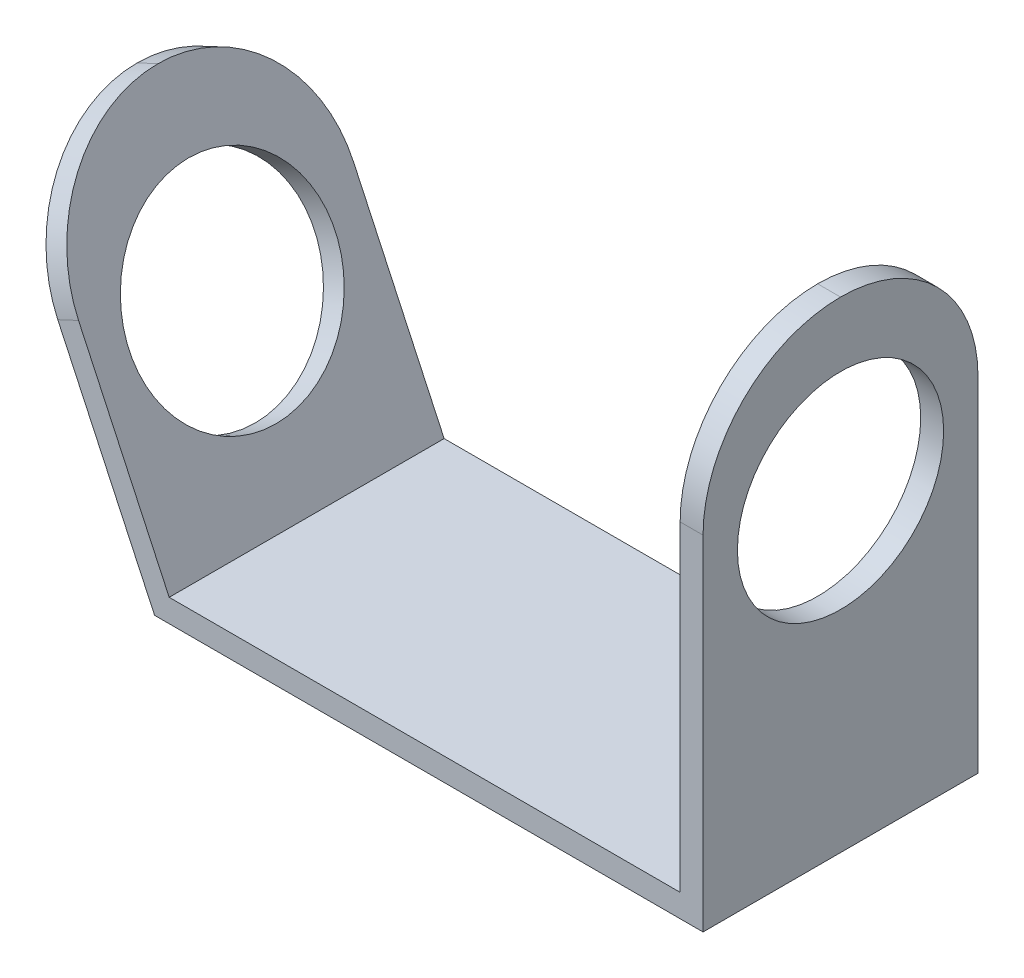
ISO-10303-21;
HEADER;
FILE_DESCRIPTION(('STEP AP214'),'2;1');
FILE_NAME('part.step','',(''),(''),'','','');
FILE_SCHEMA(('AUTOMOTIVE_DESIGN { 1 0 10303 214 1 1 1 1 }'));
ENDSEC;
DATA;
#1=APPLICATION_CONTEXT('core data for automotive mechanical design processes');
#2=APPLICATION_PROTOCOL_DEFINITION('international standard','automotive_design',2000,#1);
#3=PRODUCT_CONTEXT('',#1,'mechanical');
#4=PRODUCT('Part','Part','',(#3));
#5=PRODUCT_RELATED_PRODUCT_CATEGORY('part','',(#4));
#6=PRODUCT_DEFINITION_FORMATION('','',#4);
#7=PRODUCT_DEFINITION_CONTEXT('part definition',#1,'design');
#8=PRODUCT_DEFINITION('design','',#6,#7);
#9=PRODUCT_DEFINITION_SHAPE('','',#8);
#10=(LENGTH_UNIT() NAMED_UNIT(*) SI_UNIT(.MILLI.,.METRE.));
#11=(NAMED_UNIT(*) PLANE_ANGLE_UNIT() SI_UNIT($,.RADIAN.));
#12=(NAMED_UNIT(*) SI_UNIT($,.STERADIAN.) SOLID_ANGLE_UNIT());
#13=UNCERTAINTY_MEASURE_WITH_UNIT(LENGTH_MEASURE(1.E-05),#10,'distance_accuracy_value','');
#14=(GEOMETRIC_REPRESENTATION_CONTEXT(3) GLOBAL_UNCERTAINTY_ASSIGNED_CONTEXT((#13)) GLOBAL_UNIT_ASSIGNED_CONTEXT((#10,
#11,#12)) REPRESENTATION_CONTEXT('',''));
#15=CARTESIAN_POINT('',(0.,0.,0.));
#16=DIRECTION('',(0.,0.,1.));
#17=DIRECTION('',(1.,0.,0.));
#18=AXIS2_PLACEMENT_3D('',#15,#16,#17);
#19=CARTESIAN_POINT('',(-233.,10.,-10.));
#20=DIRECTION('',(0.906307787036651,0.422618261740697,0.));
#21=DIRECTION('',(-0.422618261740697,0.906307787036651,0.));
#22=AXIS2_PLACEMENT_3D('',#19,#20,#21);
#23=PLANE('',#22);
#24=CARTESIAN_POINT('',(-265.46327330811,79.6177142716355,50.));
#25=DIRECTION('',(0.906307787036651,0.422618261740697,0.));
#26=DIRECTION('',(-0.422618261740697,0.906307787036651,0.));
#27=AXIS2_PLACEMENT_3D('',#24,#25,#26);
#28=CIRCLE('',#27,45.);
#29=CARTESIAN_POINT('',(-284.481095086441,120.401564688285,50.));
#30=VERTEX_POINT('',#29);
#31=EDGE_CURVE('E173',#30,#30,#28,.T.);
#32=ORIENTED_EDGE('',*,*,#31,.F.);
#33=EDGE_LOOP('',(#32));
#34=FACE_BOUND('',#33,.T.);
#35=DIRECTION('',(-0.422618261740697,0.906307787036651,0.));
#36=VECTOR('',#35,1.);
#37=CARTESIAN_POINT('',(-233.,10.,-10.));
#38=LINE('',#37,#36);
#39=CARTESIAN_POINT('',(-233.,10.,-10.));
#40=VERTEX_POINT('',#39);
#41=CARTESIAN_POINT('',(-272.569450911778,94.8569613210721,-10.));
#42=VERTEX_POINT('',#41);
#43=EDGE_CURVE('E134',#40,#42,#38,.T.);
#44=ORIENTED_EDGE('',*,*,#43,.T.);
#45=CARTESIAN_POINT('',(-272.569450911778,94.8569613210721,50.));
#46=DIRECTION('',(0.906307787036651,0.422618261740697,0.));
#47=DIRECTION('',(-0.422618261740697,0.906307787036651,0.));
#48=AXIS2_PLACEMENT_3D('',#45,#46,#47);
#49=CIRCLE('',#48,60.);
#50=CARTESIAN_POINT('',(-297.92654661622,149.235428543271,50.));
#51=VERTEX_POINT('',#50);
#52=EDGE_CURVE('E11',#42,#51,#49,.T.);
#53=ORIENTED_EDGE('',*,*,#52,.T.);
#54=CARTESIAN_POINT('',(-272.569450911778,94.8569613210721,50.));
#55=DIRECTION('',(0.906307787036651,0.422618261740697,0.));
#56=DIRECTION('',(-0.422618261740697,0.906307787036651,0.));
#57=AXIS2_PLACEMENT_3D('',#54,#55,#56);
#58=CIRCLE('',#57,60.);
#59=CARTESIAN_POINT('',(-272.569450911778,94.8569613210721,110.));
#60=VERTEX_POINT('',#59);
#61=EDGE_CURVE('E45',#51,#60,#58,.T.);
#62=ORIENTED_EDGE('',*,*,#61,.T.);
#63=DIRECTION('',(-0.422618261740697,0.906307787036651,0.));
#64=VECTOR('',#63,1.);
#65=CARTESIAN_POINT('',(-233.,10.,110.));
#66=LINE('',#65,#64);
#67=CARTESIAN_POINT('',(-233.,10.,110.));
#68=VERTEX_POINT('',#67);
#69=EDGE_CURVE('E147',#68,#60,#66,.T.);
#70=ORIENTED_EDGE('',*,*,#69,.F.);
#71=DIRECTION('',(0.,0.,1.));
#72=VECTOR('',#71,1.);
#73=CARTESIAN_POINT('',(-233.,10.,-10.));
#74=LINE('',#73,#72);
#75=EDGE_CURVE('E161',#40,#68,#74,.T.);
#76=ORIENTED_EDGE('',*,*,#75,.F.);
#77=EDGE_LOOP('',(#44,#53,#62,#70,#76));
#78=FACE_BOUND('',#77,.T.);
#79=ADVANCED_FACE('F36',(#34,#78),#23,.T.);
#80=CARTESIAN_POINT('',(-10.,10.,-10.));
#81=DIRECTION('',(0.,1.,0.));
#82=DIRECTION('',(-1.,0.,0.));
#83=AXIS2_PLACEMENT_3D('',#80,#81,#82);
#84=PLANE('',#83);
#85=ORIENTED_EDGE('',*,*,#75,.T.);
#86=DIRECTION('',(-1.,0.,0.));
#87=VECTOR('',#86,1.);
#88=CARTESIAN_POINT('',(-10.,10.,110.));
#89=LINE('',#88,#87);
#90=CARTESIAN_POINT('',(-10.,10.,110.));
#91=VERTEX_POINT('',#90);
#92=EDGE_CURVE('E144',#91,#68,#89,.T.);
#93=ORIENTED_EDGE('',*,*,#92,.F.);
#94=DIRECTION('',(0.,0.,1.));
#95=VECTOR('',#94,1.);
#96=CARTESIAN_POINT('',(-10.,10.,-10.));
#97=LINE('',#96,#95);
#98=CARTESIAN_POINT('',(-10.,10.,-10.));
#99=VERTEX_POINT('',#98);
#100=EDGE_CURVE('E163',#99,#91,#97,.T.);
#101=ORIENTED_EDGE('',*,*,#100,.F.);
#102=DIRECTION('',(-1.,0.,0.));
#103=VECTOR('',#102,1.);
#104=CARTESIAN_POINT('',(-10.,10.,-10.));
#105=LINE('',#104,#103);
#106=EDGE_CURVE('E157',#99,#40,#105,.T.);
#107=ORIENTED_EDGE('',*,*,#106,.T.);
#108=EDGE_LOOP('',(#85,#93,#101,#107));
#109=FACE_BOUND('',#108,.T.);
#110=ADVANCED_FACE('F212',(#109),#84,.T.);
#111=CARTESIAN_POINT('',(-10.,210.,-10.));
#112=DIRECTION('',(-1.,0.,0.));
#113=DIRECTION('',(0.,0.,1.));
#114=AXIS2_PLACEMENT_3D('',#111,#112,#113);
#115=PLANE('',#114);
#116=CARTESIAN_POINT('',(-10.,136.841249694497,50.));
#117=DIRECTION('',(-1.,0.,0.));
#118=DIRECTION('',(0.,0.,1.));
#119=AXIS2_PLACEMENT_3D('',#116,#117,#118);
#120=CIRCLE('',#119,45.);
#121=CARTESIAN_POINT('',(-10.,136.841249694497,95.));
#122=VERTEX_POINT('',#121);
#123=EDGE_CURVE('E169',#122,#122,#120,.T.);
#124=ORIENTED_EDGE('',*,*,#123,.F.);
#125=EDGE_LOOP('',(#124));
#126=FACE_BOUND('',#125,.T.);
#127=DIRECTION('',(0.,-1.,0.));
#128=VECTOR('',#127,1.);
#129=CARTESIAN_POINT('',(-10.,210.,110.));
#130=LINE('',#129,#128);
#131=CARTESIAN_POINT('',(-10.,150.,110.));
#132=VERTEX_POINT('',#131);
#133=EDGE_CURVE('E139',#132,#91,#130,.T.);
#134=ORIENTED_EDGE('',*,*,#133,.F.);
#135=CARTESIAN_POINT('',(-10.,150.,50.));
#136=DIRECTION('',(-1.,0.,0.));
#137=DIRECTION('',(0.,0.,1.));
#138=AXIS2_PLACEMENT_3D('',#135,#136,#137);
#139=CIRCLE('',#138,60.);
#140=CARTESIAN_POINT('',(-10.,210.,50.));
#141=VERTEX_POINT('',#140);
#142=EDGE_CURVE('E180',#132,#141,#139,.T.);
#143=ORIENTED_EDGE('',*,*,#142,.T.);
#144=CARTESIAN_POINT('',(-10.,150.,50.));
#145=DIRECTION('',(-1.,0.,0.));
#146=DIRECTION('',(0.,0.,1.));
#147=AXIS2_PLACEMENT_3D('',#144,#145,#146);
#148=CIRCLE('',#147,60.);
#149=CARTESIAN_POINT('',(-10.,150.,-10.));
#150=VERTEX_POINT('',#149);
#151=EDGE_CURVE('E178',#141,#150,#148,.T.);
#152=ORIENTED_EDGE('',*,*,#151,.T.);
#153=DIRECTION('',(0.,-1.,0.));
#154=VECTOR('',#153,1.);
#155=CARTESIAN_POINT('',(-10.,210.,-10.));
#156=LINE('',#155,#154);
#157=EDGE_CURVE('E155',#150,#99,#156,.T.);
#158=ORIENTED_EDGE('',*,*,#157,.T.);
#159=ORIENTED_EDGE('',*,*,#100,.T.);
#160=EDGE_LOOP('',(#134,#143,#152,#158,#159));
#161=FACE_BOUND('',#160,.T.);
#162=ADVANCED_FACE('F229',(#126,#161),#115,.T.);
#163=CARTESIAN_POINT('',(0.,0.,-10.));
#164=DIRECTION('',(1.,0.,0.));
#165=DIRECTION('',(0.,0.,-1.));
#166=AXIS2_PLACEMENT_3D('',#163,#164,#165);
#167=PLANE('',#166);
#168=CARTESIAN_POINT('',(0.,136.841249694497,50.));
#169=DIRECTION('',(1.,0.,0.));
#170=DIRECTION('',(0.,0.,-1.));
#171=AXIS2_PLACEMENT_3D('',#168,#169,#170);
#172=CIRCLE('',#171,45.);
#173=CARTESIAN_POINT('',(0.,136.841249694497,4.99999999999999));
#174=VERTEX_POINT('',#173);
#175=EDGE_CURVE('E123',#174,#174,#172,.T.);
#176=ORIENTED_EDGE('',*,*,#175,.F.);
#177=EDGE_LOOP('',(#176));
#178=FACE_BOUND('',#177,.T.);
#179=CARTESIAN_POINT('',(0.,150.,50.));
#180=DIRECTION('',(1.,0.,0.));
#181=DIRECTION('',(0.,0.,-1.));
#182=AXIS2_PLACEMENT_3D('',#179,#180,#181);
#183=CIRCLE('',#182,60.);
#184=CARTESIAN_POINT('',(0.,150.,-10.));
#185=VERTEX_POINT('',#184);
#186=CARTESIAN_POINT('',(0.,210.,50.));
#187=VERTEX_POINT('',#186);
#188=EDGE_CURVE('E182',#185,#187,#183,.T.);
#189=ORIENTED_EDGE('',*,*,#188,.T.);
#190=CARTESIAN_POINT('',(0.,150.,50.));
#191=DIRECTION('',(1.,0.,0.));
#192=DIRECTION('',(0.,0.,-1.));
#193=AXIS2_PLACEMENT_3D('',#190,#191,#192);
#194=CIRCLE('',#193,60.);
#195=CARTESIAN_POINT('',(0.,150.,110.));
#196=VERTEX_POINT('',#195);
#197=EDGE_CURVE('E184',#187,#196,#194,.T.);
#198=ORIENTED_EDGE('',*,*,#197,.T.);
#199=DIRECTION('',(0.,1.,0.));
#200=VECTOR('',#199,1.);
#201=CARTESIAN_POINT('',(0.,0.,110.));
#202=LINE('',#201,#200);
#203=CARTESIAN_POINT('',(0.,0.,110.));
#204=VERTEX_POINT('',#203);
#205=EDGE_CURVE('E137',#204,#196,#202,.T.);
#206=ORIENTED_EDGE('',*,*,#205,.F.);
#207=DIRECTION('',(0.,0.,1.));
#208=VECTOR('',#207,1.);
#209=CARTESIAN_POINT('',(0.,0.,-10.));
#210=LINE('',#209,#208);
#211=CARTESIAN_POINT('',(0.,0.,-10.));
#212=VERTEX_POINT('',#211);
#213=EDGE_CURVE('E133',#212,#204,#210,.T.);
#214=ORIENTED_EDGE('',*,*,#213,.F.);
#215=DIRECTION('',(0.,1.,0.));
#216=VECTOR('',#215,1.);
#217=CARTESIAN_POINT('',(0.,0.,-10.));
#218=LINE('',#217,#216);
#219=EDGE_CURVE('E152',#212,#185,#218,.T.);
#220=ORIENTED_EDGE('',*,*,#219,.T.);
#221=EDGE_LOOP('',(#189,#198,#206,#214,#220));
#222=FACE_BOUND('',#221,.T.);
#223=ADVANCED_FACE('F222',(#178,#222),#167,.T.);
#224=CARTESIAN_POINT('',(-239.370702608075,0.,-10.));
#225=DIRECTION('',(0.,-1.,0.));
#226=DIRECTION('',(1.,0.,0.));
#227=AXIS2_PLACEMENT_3D('',#224,#225,#226);
#228=PLANE('',#227);
#229=ORIENTED_EDGE('',*,*,#213,.T.);
#230=DIRECTION('',(1.,0.,0.));
#231=VECTOR('',#230,1.);
#232=CARTESIAN_POINT('',(-239.370702608075,0.,110.));
#233=LINE('',#232,#231);
#234=CARTESIAN_POINT('',(-239.370702608075,0.,110.));
#235=VERTEX_POINT('',#234);
#236=EDGE_CURVE('E118',#235,#204,#233,.T.);
#237=ORIENTED_EDGE('',*,*,#236,.F.);
#238=DIRECTION('',(0.,0.,1.));
#239=VECTOR('',#238,1.);
#240=CARTESIAN_POINT('',(-239.370702608075,0.,-10.));
#241=LINE('',#240,#239);
#242=CARTESIAN_POINT('',(-239.370702608075,0.,-10.));
#243=VERTEX_POINT('',#242);
#244=EDGE_CURVE('E126',#243,#235,#241,.T.);
#245=ORIENTED_EDGE('',*,*,#244,.F.);
#246=DIRECTION('',(1.,0.,0.));
#247=VECTOR('',#246,1.);
#248=CARTESIAN_POINT('',(-239.370702608075,0.,-10.));
#249=LINE('',#248,#247);
#250=EDGE_CURVE('E150',#243,#212,#249,.T.);
#251=ORIENTED_EDGE('',*,*,#250,.T.);
#252=EDGE_LOOP('',(#229,#237,#245,#251));
#253=FACE_BOUND('',#252,.T.);
#254=ADVANCED_FACE('F136',(#253),#228,.T.);
#255=CARTESIAN_POINT('',(-306.989624486587,145.009245925864,-10.));
#256=DIRECTION('',(-0.906307787036651,-0.422618261740697,0.));
#257=DIRECTION('',(0.422618261740697,-0.906307787036651,0.));
#258=AXIS2_PLACEMENT_3D('',#255,#256,#257);
#259=PLANE('',#258);
#260=CARTESIAN_POINT('',(-274.526351178477,75.3915316542286,50.));
#261=DIRECTION('',(-0.906307787036651,-0.422618261740697,0.));
#262=DIRECTION('',(0.422618261740697,-0.906307787036651,0.));
#263=AXIS2_PLACEMENT_3D('',#260,#261,#262);
#264=CIRCLE('',#263,45.);
#265=CARTESIAN_POINT('',(-255.508529400145,34.6076812375792,50.));
#266=VERTEX_POINT('',#265);
#267=EDGE_CURVE('E170',#266,#266,#264,.T.);
#268=ORIENTED_EDGE('',*,*,#267,.F.);
#269=EDGE_LOOP('',(#268));
#270=FACE_BOUND('',#269,.T.);
#271=CARTESIAN_POINT('',(-281.632528782145,90.6307787036652,50.));
#272=DIRECTION('',(-0.906307787036651,-0.422618261740697,0.));
#273=DIRECTION('',(0.422618261740697,-0.906307787036651,0.));
#274=AXIS2_PLACEMENT_3D('',#271,#272,#273);
#275=CIRCLE('',#274,60.);
#276=CARTESIAN_POINT('',(-281.632528782145,90.6307787036652,110.));
#277=VERTEX_POINT('',#276);
#278=CARTESIAN_POINT('',(-306.989624486587,145.009245925864,50.));
#279=VERTEX_POINT('',#278);
#280=EDGE_CURVE('E59',#277,#279,#275,.T.);
#281=ORIENTED_EDGE('',*,*,#280,.T.);
#282=CARTESIAN_POINT('',(-281.632528782145,90.6307787036651,50.));
#283=DIRECTION('',(-0.906307787036651,-0.422618261740697,0.));
#284=DIRECTION('',(0.422618261740697,-0.906307787036651,0.));
#285=AXIS2_PLACEMENT_3D('',#282,#283,#284);
#286=CIRCLE('',#285,60.);
#287=CARTESIAN_POINT('',(-281.632528782145,90.6307787036652,-10.));
#288=VERTEX_POINT('',#287);
#289=EDGE_CURVE('E192',#279,#288,#286,.T.);
#290=ORIENTED_EDGE('',*,*,#289,.T.);
#291=DIRECTION('',(0.422618261740697,-0.906307787036651,0.));
#292=VECTOR('',#291,1.);
#293=CARTESIAN_POINT('',(-306.989624486587,145.009245925864,-10.));
#294=LINE('',#293,#292);
#295=EDGE_CURVE('E129',#288,#243,#294,.T.);
#296=ORIENTED_EDGE('',*,*,#295,.T.);
#297=ORIENTED_EDGE('',*,*,#244,.T.);
#298=DIRECTION('',(0.422618261740697,-0.906307787036651,0.));
#299=VECTOR('',#298,1.);
#300=CARTESIAN_POINT('',(-306.989624486587,145.009245925864,110.));
#301=LINE('',#300,#299);
#302=EDGE_CURVE('E113',#277,#235,#301,.T.);
#303=ORIENTED_EDGE('',*,*,#302,.F.);
#304=EDGE_LOOP('',(#281,#290,#296,#297,#303));
#305=FACE_BOUND('',#304,.T.);
#306=ADVANCED_FACE('F127',(#270,#305),#259,.T.);
#307=CARTESIAN_POINT('',(0.,0.,-10.));
#308=DIRECTION('',(0.,0.,1.));
#309=DIRECTION('',(1.,0.,0.));
#310=AXIS2_PLACEMENT_3D('',#307,#308,#309);
#311=PLANE('',#310);
#312=ORIENTED_EDGE('',*,*,#157,.F.);
#313=DIRECTION('',(-1.,0.,0.));
#314=VECTOR('',#313,1.);
#315=CARTESIAN_POINT('',(0.,150.,-10.));
#316=LINE('',#315,#314);
#317=EDGE_CURVE('E189',#150,#185,#316,.F.);
#318=ORIENTED_EDGE('',*,*,#317,.T.);
#319=ORIENTED_EDGE('',*,*,#219,.F.);
#320=ORIENTED_EDGE('',*,*,#250,.F.);
#321=ORIENTED_EDGE('',*,*,#295,.F.);
#322=DIRECTION('',(-0.906307787036652,-0.422618261740695,0.));
#323=VECTOR('',#322,1.);
#324=CARTESIAN_POINT('',(-272.569450911778,94.856961321072,-10.));
#325=LINE('',#324,#323);
#326=EDGE_CURVE('E186',#288,#42,#325,.F.);
#327=ORIENTED_EDGE('',*,*,#326,.T.);
#328=ORIENTED_EDGE('',*,*,#43,.F.);
#329=ORIENTED_EDGE('',*,*,#106,.F.);
#330=EDGE_LOOP('',(#312,#318,#319,#320,#321,#327,#328,#329));
#331=FACE_BOUND('',#330,.T.);
#332=ADVANCED_FACE('F217',(#331),#311,.F.);
#333=CARTESIAN_POINT('',(0.,0.,110.));
#334=DIRECTION('',(0.,0.,1.));
#335=DIRECTION('',(1.,0.,0.));
#336=AXIS2_PLACEMENT_3D('',#333,#334,#335);
#337=PLANE('',#336);
#338=ORIENTED_EDGE('',*,*,#205,.T.);
#339=DIRECTION('',(-1.,0.,0.));
#340=VECTOR('',#339,1.);
#341=CARTESIAN_POINT('',(0.,150.,110.));
#342=LINE('',#341,#340);
#343=EDGE_CURVE('E175',#196,#132,#342,.T.);
#344=ORIENTED_EDGE('',*,*,#343,.T.);
#345=ORIENTED_EDGE('',*,*,#133,.T.);
#346=ORIENTED_EDGE('',*,*,#92,.T.);
#347=ORIENTED_EDGE('',*,*,#69,.T.);
#348=DIRECTION('',(-0.906307787036652,-0.422618261740695,0.));
#349=VECTOR('',#348,1.);
#350=CARTESIAN_POINT('',(-85.0149165988901,182.315076992865,110.));
#351=LINE('',#350,#349);
#352=EDGE_CURVE('E122',#60,#277,#351,.T.);
#353=ORIENTED_EDGE('',*,*,#352,.T.);
#354=ORIENTED_EDGE('',*,*,#302,.T.);
#355=ORIENTED_EDGE('',*,*,#236,.T.);
#356=EDGE_LOOP('',(#338,#344,#345,#346,#347,#353,#354,#355));
#357=FACE_BOUND('',#356,.T.);
#358=ADVANCED_FACE('F116',(#357),#337,.T.);
#359=CARTESIAN_POINT('',(90.,136.841249694497,50.));
#360=DIRECTION('',(-1.,0.,0.));
#361=DIRECTION('',(0.,0.,1.));
#362=AXIS2_PLACEMENT_3D('',#359,#360,#361);
#363=CYLINDRICAL_SURFACE('',#362,45.);
#364=ORIENTED_EDGE('',*,*,#175,.T.);
#365=EDGE_LOOP('',(#364));
#366=FACE_BOUND('',#365,.T.);
#367=ORIENTED_EDGE('',*,*,#123,.T.);
#368=EDGE_LOOP('',(#367));
#369=FACE_BOUND('',#368,.T.);
#370=ADVANCED_FACE('F252',(#366,#369),#363,.F.);
#371=CARTESIAN_POINT('',(-356.094052011775,37.3558880975658,50.));
#372=DIRECTION('',(0.906307787036651,0.422618261740697,0.));
#373=DIRECTION('',(-0.422618261740697,0.906307787036651,0.));
#374=AXIS2_PLACEMENT_3D('',#371,#372,#373);
#375=CYLINDRICAL_SURFACE('',#374,45.);
#376=ORIENTED_EDGE('',*,*,#267,.T.);
#377=EDGE_LOOP('',(#376));
#378=FACE_BOUND('',#377,.T.);
#379=ORIENTED_EDGE('',*,*,#31,.T.);
#380=EDGE_LOOP('',(#379));
#381=FACE_BOUND('',#380,.T.);
#382=ADVANCED_FACE('F255',(#378,#381),#375,.F.);
#383=CARTESIAN_POINT('',(0.,150.,50.));
#384=DIRECTION('',(1.,0.,0.));
#385=DIRECTION('',(0.,0.,-1.));
#386=AXIS2_PLACEMENT_3D('',#383,#384,#385);
#387=CYLINDRICAL_SURFACE('',#386,60.);
#388=DIRECTION('',(-1.,0.,0.));
#389=VECTOR('',#388,1.);
#390=CARTESIAN_POINT('',(-10.,210.,50.));
#391=LINE('',#390,#389);
#392=EDGE_CURVE('E194',#187,#141,#391,.T.);
#393=ORIENTED_EDGE('',*,*,#392,.F.);
#394=ORIENTED_EDGE('',*,*,#188,.F.);
#395=ORIENTED_EDGE('',*,*,#317,.F.);
#396=ORIENTED_EDGE('',*,*,#151,.F.);
#397=EDGE_LOOP('',(#393,#394,#395,#396));
#398=FACE_BOUND('',#397,.T.);
#399=ADVANCED_FACE('F224',(#398),#387,.T.);
#400=CARTESIAN_POINT('',(0.,150.,50.));
#401=DIRECTION('',(-1.,0.,0.));
#402=DIRECTION('',(0.,0.,1.));
#403=AXIS2_PLACEMENT_3D('',#400,#401,#402);
#404=CYLINDRICAL_SURFACE('',#403,60.);
#405=ORIENTED_EDGE('',*,*,#197,.F.);
#406=ORIENTED_EDGE('',*,*,#392,.T.);
#407=ORIENTED_EDGE('',*,*,#142,.F.);
#408=ORIENTED_EDGE('',*,*,#343,.F.);
#409=EDGE_LOOP('',(#405,#406,#407,#408));
#410=FACE_BOUND('',#409,.T.);
#411=ADVANCED_FACE('F227',(#410),#404,.T.);
#412=CARTESIAN_POINT('',(-85.0149165988901,182.315076992865,50.));
#413=DIRECTION('',(-0.906307787036652,-0.422618261740695,0.));
#414=DIRECTION('',(0.422618261740695,-0.906307787036652,0.));
#415=AXIS2_PLACEMENT_3D('',#412,#413,#414);
#416=CYLINDRICAL_SURFACE('',#415,60.);
#417=ORIENTED_EDGE('',*,*,#352,.F.);
#418=ORIENTED_EDGE('',*,*,#61,.F.);
#419=DIRECTION('',(-0.906307787036652,-0.422618261740695,0.));
#420=VECTOR('',#419,1.);
#421=CARTESIAN_POINT('',(-297.92654661622,149.235428543271,50.));
#422=LINE('',#421,#420);
#423=EDGE_CURVE('E40',#279,#51,#422,.F.);
#424=ORIENTED_EDGE('',*,*,#423,.F.);
#425=ORIENTED_EDGE('',*,*,#280,.F.);
#426=EDGE_LOOP('',(#417,#418,#424,#425));
#427=FACE_BOUND('',#426,.T.);
#428=ADVANCED_FACE('F38',(#427),#416,.T.);
#429=CARTESIAN_POINT('',(-272.569450911778,94.856961321072,50.));
#430=DIRECTION('',(0.906307787036652,0.422618261740695,0.));
#431=DIRECTION('',(-0.422618261740695,0.906307787036652,0.));
#432=AXIS2_PLACEMENT_3D('',#429,#430,#431);
#433=CYLINDRICAL_SURFACE('',#432,60.);
#434=ORIENTED_EDGE('',*,*,#52,.F.);
#435=ORIENTED_EDGE('',*,*,#326,.F.);
#436=ORIENTED_EDGE('',*,*,#289,.F.);
#437=ORIENTED_EDGE('',*,*,#423,.T.);
#438=EDGE_LOOP('',(#434,#435,#436,#437));
#439=FACE_BOUND('',#438,.T.);
#440=ADVANCED_FACE('F204',(#439),#433,.T.);
#441=CLOSED_SHELL('',(#79,#110,#162,#223,#254,#306,#332,#358,#370,#382,#399,#411,#428,#440));
#442=MANIFOLD_SOLID_BREP('B2',#441);
#443=ADVANCED_BREP_SHAPE_REPRESENTATION('',(#18,#442),#14);
#444=SHAPE_DEFINITION_REPRESENTATION(#9,#443);
ENDSEC;
END-ISO-10303-21;
